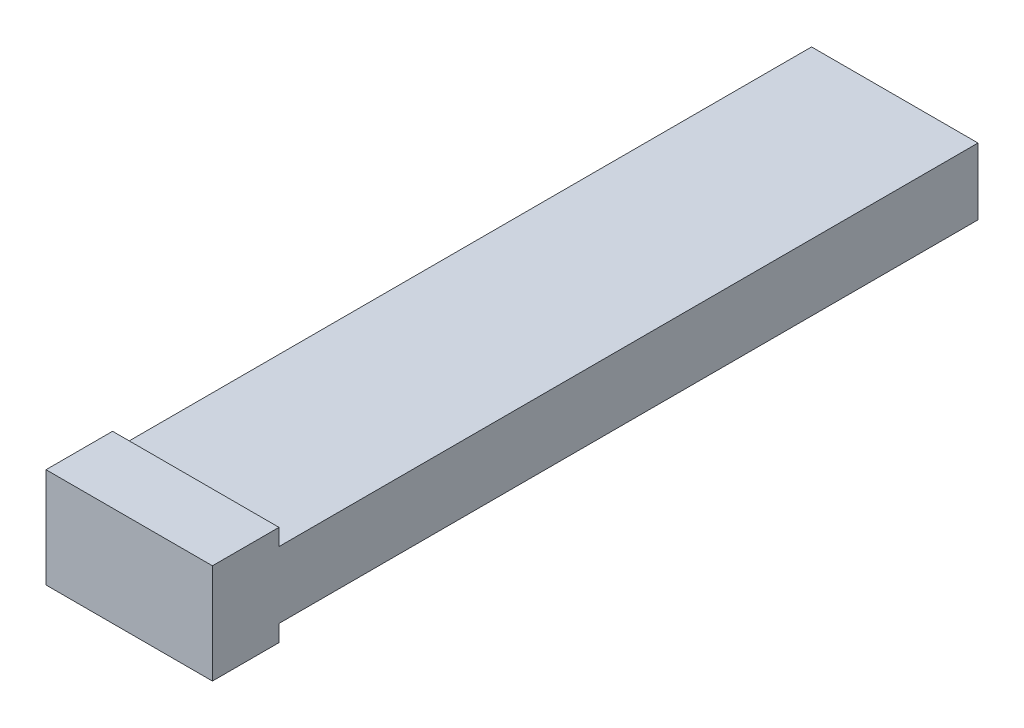
ISO-10303-21;
HEADER;
FILE_DESCRIPTION(('STEP AP214'),'2;1');
FILE_NAME('part.step','',(''),(''),'','','');
FILE_SCHEMA(('AUTOMOTIVE_DESIGN { 1 0 10303 214 1 1 1 1 }'));
ENDSEC;
DATA;
#1=APPLICATION_CONTEXT('core data for automotive mechanical design processes');
#2=APPLICATION_PROTOCOL_DEFINITION('international standard','automotive_design',2000,#1);
#3=PRODUCT_CONTEXT('',#1,'mechanical');
#4=PRODUCT('Part','Part','',(#3));
#5=PRODUCT_RELATED_PRODUCT_CATEGORY('part','',(#4));
#6=PRODUCT_DEFINITION_FORMATION('','',#4);
#7=PRODUCT_DEFINITION_CONTEXT('part definition',#1,'design');
#8=PRODUCT_DEFINITION('design','',#6,#7);
#9=PRODUCT_DEFINITION_SHAPE('','',#8);
#10=(LENGTH_UNIT() NAMED_UNIT(*) SI_UNIT(.MILLI.,.METRE.));
#11=(NAMED_UNIT(*) PLANE_ANGLE_UNIT() SI_UNIT($,.RADIAN.));
#12=(NAMED_UNIT(*) SI_UNIT($,.STERADIAN.) SOLID_ANGLE_UNIT());
#13=UNCERTAINTY_MEASURE_WITH_UNIT(LENGTH_MEASURE(1.E-05),#10,'distance_accuracy_value','');
#14=(GEOMETRIC_REPRESENTATION_CONTEXT(3) GLOBAL_UNCERTAINTY_ASSIGNED_CONTEXT((#13)) GLOBAL_UNIT_ASSIGNED_CONTEXT((#10,
#11,#12)) REPRESENTATION_CONTEXT('',''));
#15=CARTESIAN_POINT('',(0.,0.,0.));
#16=DIRECTION('',(0.,0.,1.));
#17=DIRECTION('',(1.,0.,0.));
#18=AXIS2_PLACEMENT_3D('',#15,#16,#17);
#19=CARTESIAN_POINT('',(2.5,-1.,21.));
#20=DIRECTION('',(-1.,0.,0.));
#21=DIRECTION('',(0.,0.,1.));
#22=AXIS2_PLACEMENT_3D('',#19,#20,#21);
#23=PLANE('',#22);
#24=DIRECTION('',(0.,1.,0.));
#25=VECTOR('',#24,1.);
#26=CARTESIAN_POINT('',(2.5,-1.,0.));
#27=LINE('',#26,#25);
#28=CARTESIAN_POINT('',(2.5,-1.,0.));
#29=VERTEX_POINT('',#28);
#30=CARTESIAN_POINT('',(2.5,1.,0.));
#31=VERTEX_POINT('',#30);
#32=EDGE_CURVE('E134',#29,#31,#27,.T.);
#33=ORIENTED_EDGE('',*,*,#32,.T.);
#34=DIRECTION('',(0.,0.,-1.));
#35=VECTOR('',#34,1.);
#36=CARTESIAN_POINT('',(2.5,1.,21.));
#37=LINE('',#36,#35);
#38=CARTESIAN_POINT('',(2.5,1.,21.));
#39=VERTEX_POINT('',#38);
#40=EDGE_CURVE('E11',#39,#31,#37,.T.);
#41=ORIENTED_EDGE('',*,*,#40,.F.);
#42=DIRECTION('',(0.,1.,0.));
#43=VECTOR('',#42,1.);
#44=CARTESIAN_POINT('',(2.5,-1.5,21.));
#45=LINE('',#44,#43);
#46=CARTESIAN_POINT('',(2.5,1.5,21.));
#47=VERTEX_POINT('',#46);
#48=EDGE_CURVE('E132',#39,#47,#45,.T.);
#49=ORIENTED_EDGE('',*,*,#48,.T.);
#50=DIRECTION('',(0.,0.,-1.));
#51=VECTOR('',#50,1.);
#52=CARTESIAN_POINT('',(2.5,1.5,23.));
#53=LINE('',#52,#51);
#54=CARTESIAN_POINT('',(2.5,1.5,23.));
#55=VERTEX_POINT('',#54);
#56=EDGE_CURVE('E113',#55,#47,#53,.T.);
#57=ORIENTED_EDGE('',*,*,#56,.F.);
#58=DIRECTION('',(0.,1.,0.));
#59=VECTOR('',#58,1.);
#60=CARTESIAN_POINT('',(2.5,-1.5,23.));
#61=LINE('',#60,#59);
#62=CARTESIAN_POINT('',(2.5,-1.5,23.));
#63=VERTEX_POINT('',#62);
#64=EDGE_CURVE('E119',#63,#55,#61,.T.);
#65=ORIENTED_EDGE('',*,*,#64,.F.);
#66=DIRECTION('',(0.,0.,-1.));
#67=VECTOR('',#66,1.);
#68=CARTESIAN_POINT('',(2.5,-1.5,23.));
#69=LINE('',#68,#67);
#70=CARTESIAN_POINT('',(2.5,-1.5,21.));
#71=VERTEX_POINT('',#70);
#72=EDGE_CURVE('E175',#63,#71,#69,.T.);
#73=ORIENTED_EDGE('',*,*,#72,.T.);
#74=CARTESIAN_POINT('',(2.5,-1.,21.));
#75=VERTEX_POINT('',#74);
#76=EDGE_CURVE('E160',#71,#75,#45,.T.);
#77=ORIENTED_EDGE('',*,*,#76,.T.);
#78=DIRECTION('',(0.,0.,-1.));
#79=VECTOR('',#78,1.);
#80=CARTESIAN_POINT('',(2.5,-1.,21.));
#81=LINE('',#80,#79);
#82=EDGE_CURVE('E145',#75,#29,#81,.T.);
#83=ORIENTED_EDGE('',*,*,#82,.T.);
#84=EDGE_LOOP('',(#33,#41,#49,#57,#65,#73,#77,#83));
#85=FACE_BOUND('',#84,.T.);
#86=ADVANCED_FACE('F38',(#85),#23,.F.);
#87=CARTESIAN_POINT('',(-2.5,1.,21.));
#88=DIRECTION('',(0.,-1.,0.));
#89=DIRECTION('',(0.,0.,-1.));
#90=AXIS2_PLACEMENT_3D('',#87,#88,#89);
#91=PLANE('',#90);
#92=DIRECTION('',(-1.,0.,0.));
#93=VECTOR('',#92,1.);
#94=CARTESIAN_POINT('',(-2.5,1.,0.));
#95=LINE('',#94,#93);
#96=CARTESIAN_POINT('',(-2.5,1.,0.));
#97=VERTEX_POINT('',#96);
#98=EDGE_CURVE('E136',#31,#97,#95,.T.);
#99=ORIENTED_EDGE('',*,*,#98,.T.);
#100=DIRECTION('',(0.,0.,-1.));
#101=VECTOR('',#100,1.);
#102=CARTESIAN_POINT('',(-2.5,1.,21.));
#103=LINE('',#102,#101);
#104=CARTESIAN_POINT('',(-2.5,1.,21.));
#105=VERTEX_POINT('',#104);
#106=EDGE_CURVE('E46',#105,#97,#103,.T.);
#107=ORIENTED_EDGE('',*,*,#106,.F.);
#108=DIRECTION('',(-1.,0.,0.));
#109=VECTOR('',#108,1.);
#110=CARTESIAN_POINT('',(-2.5,1.,21.));
#111=LINE('',#110,#109);
#112=EDGE_CURVE('E80',#39,#105,#111,.T.);
#113=ORIENTED_EDGE('',*,*,#112,.F.);
#114=ORIENTED_EDGE('',*,*,#40,.T.);
#115=EDGE_LOOP('',(#99,#107,#113,#114));
#116=FACE_BOUND('',#115,.T.);
#117=ADVANCED_FACE('F195',(#116),#91,.F.);
#118=CARTESIAN_POINT('',(-2.5,-1.,21.));
#119=DIRECTION('',(1.,0.,0.));
#120=DIRECTION('',(0.,0.,-1.));
#121=AXIS2_PLACEMENT_3D('',#118,#119,#120);
#122=PLANE('',#121);
#123=DIRECTION('',(0.,-1.,0.));
#124=VECTOR('',#123,1.);
#125=CARTESIAN_POINT('',(-2.5,-1.,0.));
#126=LINE('',#125,#124);
#127=CARTESIAN_POINT('',(-2.5,-1.,0.));
#128=VERTEX_POINT('',#127);
#129=EDGE_CURVE('E70',#97,#128,#126,.T.);
#130=ORIENTED_EDGE('',*,*,#129,.T.);
#131=DIRECTION('',(0.,0.,-1.));
#132=VECTOR('',#131,1.);
#133=CARTESIAN_POINT('',(-2.5,-1.,21.));
#134=LINE('',#133,#132);
#135=CARTESIAN_POINT('',(-2.5,-1.,21.));
#136=VERTEX_POINT('',#135);
#137=EDGE_CURVE('E54',#136,#128,#134,.T.);
#138=ORIENTED_EDGE('',*,*,#137,.F.);
#139=DIRECTION('',(0.,-1.,0.));
#140=VECTOR('',#139,1.);
#141=CARTESIAN_POINT('',(-2.5,-1.5,21.));
#142=LINE('',#141,#140);
#143=CARTESIAN_POINT('',(-2.5,-1.5,21.));
#144=VERTEX_POINT('',#143);
#145=EDGE_CURVE('E166',#136,#144,#142,.T.);
#146=ORIENTED_EDGE('',*,*,#145,.T.);
#147=DIRECTION('',(0.,0.,-1.));
#148=VECTOR('',#147,1.);
#149=CARTESIAN_POINT('',(-2.5,-1.5,23.));
#150=LINE('',#149,#148);
#151=CARTESIAN_POINT('',(-2.5,-1.5,23.));
#152=VERTEX_POINT('',#151);
#153=EDGE_CURVE('E138',#152,#144,#150,.T.);
#154=ORIENTED_EDGE('',*,*,#153,.F.);
#155=DIRECTION('',(0.,-1.,0.));
#156=VECTOR('',#155,1.);
#157=CARTESIAN_POINT('',(-2.5,-1.5,23.));
#158=LINE('',#157,#156);
#159=CARTESIAN_POINT('',(-2.5,1.5,23.));
#160=VERTEX_POINT('',#159);
#161=EDGE_CURVE('E118',#160,#152,#158,.T.);
#162=ORIENTED_EDGE('',*,*,#161,.F.);
#163=DIRECTION('',(0.,0.,-1.));
#164=VECTOR('',#163,1.);
#165=CARTESIAN_POINT('',(-2.5,1.5,23.));
#166=LINE('',#165,#164);
#167=CARTESIAN_POINT('',(-2.5,1.5,21.));
#168=VERTEX_POINT('',#167);
#169=EDGE_CURVE('E115',#160,#168,#166,.T.);
#170=ORIENTED_EDGE('',*,*,#169,.T.);
#171=EDGE_CURVE('E154',#168,#105,#142,.T.);
#172=ORIENTED_EDGE('',*,*,#171,.T.);
#173=ORIENTED_EDGE('',*,*,#106,.T.);
#174=EDGE_LOOP('',(#130,#138,#146,#154,#162,#170,#172,#173));
#175=FACE_BOUND('',#174,.T.);
#176=ADVANCED_FACE('F152',(#175),#122,.F.);
#177=CARTESIAN_POINT('',(-2.5,-1.,21.));
#178=DIRECTION('',(0.,1.,0.));
#179=DIRECTION('',(0.,0.,1.));
#180=AXIS2_PLACEMENT_3D('',#177,#178,#179);
#181=PLANE('',#180);
#182=DIRECTION('',(1.,0.,0.));
#183=VECTOR('',#182,1.);
#184=CARTESIAN_POINT('',(-2.5,-1.,0.));
#185=LINE('',#184,#183);
#186=EDGE_CURVE('E75',#128,#29,#185,.T.);
#187=ORIENTED_EDGE('',*,*,#186,.T.);
#188=ORIENTED_EDGE('',*,*,#82,.F.);
#189=DIRECTION('',(1.,0.,0.));
#190=VECTOR('',#189,1.);
#191=CARTESIAN_POINT('',(-2.5,-1.,21.));
#192=LINE('',#191,#190);
#193=EDGE_CURVE('E143',#136,#75,#192,.T.);
#194=ORIENTED_EDGE('',*,*,#193,.F.);
#195=ORIENTED_EDGE('',*,*,#137,.T.);
#196=EDGE_LOOP('',(#187,#188,#194,#195));
#197=FACE_BOUND('',#196,.T.);
#198=ADVANCED_FACE('F161',(#197),#181,.F.);
#199=CARTESIAN_POINT('',(0.,0.,0.));
#200=DIRECTION('',(0.,0.,-1.));
#201=DIRECTION('',(-1.,0.,0.));
#202=AXIS2_PLACEMENT_3D('',#199,#200,#201);
#203=PLANE('',#202);
#204=ORIENTED_EDGE('',*,*,#32,.F.);
#205=ORIENTED_EDGE('',*,*,#186,.F.);
#206=ORIENTED_EDGE('',*,*,#129,.F.);
#207=ORIENTED_EDGE('',*,*,#98,.F.);
#208=EDGE_LOOP('',(#204,#205,#206,#207));
#209=FACE_BOUND('',#208,.T.);
#210=ADVANCED_FACE('F157',(#209),#203,.T.);
#211=CARTESIAN_POINT('',(0.,0.,21.));
#212=DIRECTION('',(0.,0.,-1.));
#213=DIRECTION('',(-1.,0.,0.));
#214=AXIS2_PLACEMENT_3D('',#211,#212,#213);
#215=PLANE('',#214);
#216=ORIENTED_EDGE('',*,*,#48,.F.);
#217=ORIENTED_EDGE('',*,*,#112,.T.);
#218=ORIENTED_EDGE('',*,*,#171,.F.);
#219=DIRECTION('',(-1.,0.,0.));
#220=VECTOR('',#219,1.);
#221=CARTESIAN_POINT('',(-2.5,1.5,21.));
#222=LINE('',#221,#220);
#223=EDGE_CURVE('E169',#47,#168,#222,.T.);
#224=ORIENTED_EDGE('',*,*,#223,.F.);
#225=EDGE_LOOP('',(#216,#217,#218,#224));
#226=FACE_BOUND('',#225,.T.);
#227=ADVANCED_FACE('F181',(#226),#215,.T.);
#228=CARTESIAN_POINT('',(-2.5,1.5,23.));
#229=DIRECTION('',(0.,-1.,0.));
#230=DIRECTION('',(0.,0.,-1.));
#231=AXIS2_PLACEMENT_3D('',#228,#229,#230);
#232=PLANE('',#231);
#233=ORIENTED_EDGE('',*,*,#223,.T.);
#234=ORIENTED_EDGE('',*,*,#169,.F.);
#235=DIRECTION('',(-1.,0.,0.));
#236=VECTOR('',#235,1.);
#237=CARTESIAN_POINT('',(-2.5,1.5,23.));
#238=LINE('',#237,#236);
#239=EDGE_CURVE('E109',#55,#160,#238,.T.);
#240=ORIENTED_EDGE('',*,*,#239,.F.);
#241=ORIENTED_EDGE('',*,*,#56,.T.);
#242=EDGE_LOOP('',(#233,#234,#240,#241));
#243=FACE_BOUND('',#242,.T.);
#244=ADVANCED_FACE('F111',(#243),#232,.F.);
#245=CARTESIAN_POINT('',(-2.5,-1.5,23.));
#246=DIRECTION('',(0.,1.,0.));
#247=DIRECTION('',(0.,0.,1.));
#248=AXIS2_PLACEMENT_3D('',#245,#246,#247);
#249=PLANE('',#248);
#250=DIRECTION('',(1.,0.,0.));
#251=VECTOR('',#250,1.);
#252=CARTESIAN_POINT('',(-2.5,-1.5,21.));
#253=LINE('',#252,#251);
#254=EDGE_CURVE('E128',#144,#71,#253,.T.);
#255=ORIENTED_EDGE('',*,*,#254,.T.);
#256=ORIENTED_EDGE('',*,*,#72,.F.);
#257=DIRECTION('',(1.,0.,0.));
#258=VECTOR('',#257,1.);
#259=CARTESIAN_POINT('',(-2.5,-1.5,23.));
#260=LINE('',#259,#258);
#261=EDGE_CURVE('E124',#152,#63,#260,.T.);
#262=ORIENTED_EDGE('',*,*,#261,.F.);
#263=ORIENTED_EDGE('',*,*,#153,.T.);
#264=EDGE_LOOP('',(#255,#256,#262,#263));
#265=FACE_BOUND('',#264,.T.);
#266=ADVANCED_FACE('F177',(#265),#249,.F.);
#267=CARTESIAN_POINT('',(0.,0.,23.));
#268=DIRECTION('',(0.,0.,-1.));
#269=DIRECTION('',(-1.,0.,0.));
#270=AXIS2_PLACEMENT_3D('',#267,#268,#269);
#271=PLANE('',#270);
#272=ORIENTED_EDGE('',*,*,#64,.T.);
#273=ORIENTED_EDGE('',*,*,#239,.T.);
#274=ORIENTED_EDGE('',*,*,#161,.T.);
#275=ORIENTED_EDGE('',*,*,#261,.T.);
#276=EDGE_LOOP('',(#272,#273,#274,#275));
#277=FACE_BOUND('',#276,.T.);
#278=ADVANCED_FACE('F122',(#277),#271,.F.);
#279=ORIENTED_EDGE('',*,*,#145,.F.);
#280=ORIENTED_EDGE('',*,*,#193,.T.);
#281=ORIENTED_EDGE('',*,*,#76,.F.);
#282=ORIENTED_EDGE('',*,*,#254,.F.);
#283=EDGE_LOOP('',(#279,#280,#281,#282));
#284=FACE_BOUND('',#283,.T.);
#285=ADVANCED_FACE('F164',(#284),#215,.T.);
#286=CLOSED_SHELL('',(#86,#117,#176,#198,#210,#227,#244,#266,#278,#285));
#287=MANIFOLD_SOLID_BREP('B2',#286);
#288=ADVANCED_BREP_SHAPE_REPRESENTATION('',(#18,#287),#14);
#289=SHAPE_DEFINITION_REPRESENTATION(#9,#288);
ENDSEC;
END-ISO-10303-21;
